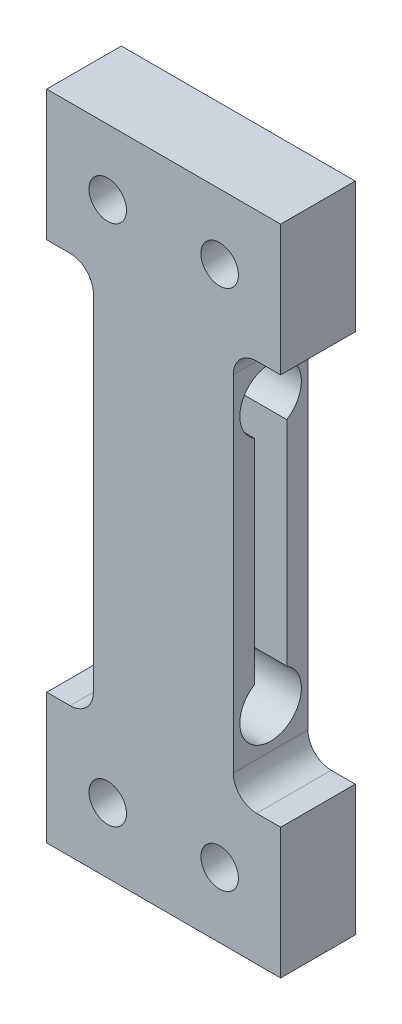
ISO-10303-21;
HEADER;
FILE_DESCRIPTION(('STEP AP214'),'2;1');
FILE_NAME('part.step','',(''),(''),'','','');
FILE_SCHEMA(('AUTOMOTIVE_DESIGN { 1 0 10303 214 1 1 1 1 }'));
ENDSEC;
DATA;
#1=APPLICATION_CONTEXT('core data for automotive mechanical design processes');
#2=APPLICATION_PROTOCOL_DEFINITION('international standard','automotive_design',2000,#1);
#3=PRODUCT_CONTEXT('',#1,'mechanical');
#4=PRODUCT('Part','Part','',(#3));
#5=PRODUCT_RELATED_PRODUCT_CATEGORY('part','',(#4));
#6=PRODUCT_DEFINITION_FORMATION('','',#4);
#7=PRODUCT_DEFINITION_CONTEXT('part definition',#1,'design');
#8=PRODUCT_DEFINITION('design','',#6,#7);
#9=PRODUCT_DEFINITION_SHAPE('','',#8);
#10=(LENGTH_UNIT() NAMED_UNIT(*) SI_UNIT(.MILLI.,.METRE.));
#11=(NAMED_UNIT(*) PLANE_ANGLE_UNIT() SI_UNIT($,.RADIAN.));
#12=(NAMED_UNIT(*) SI_UNIT($,.STERADIAN.) SOLID_ANGLE_UNIT());
#13=UNCERTAINTY_MEASURE_WITH_UNIT(LENGTH_MEASURE(1.E-05),#10,'distance_accuracy_value','');
#14=(GEOMETRIC_REPRESENTATION_CONTEXT(3) GLOBAL_UNCERTAINTY_ASSIGNED_CONTEXT((#13)) GLOBAL_UNIT_ASSIGNED_CONTEXT((#10,
#11,#12)) REPRESENTATION_CONTEXT('',''));
#15=CARTESIAN_POINT('',(0.,0.,0.));
#16=DIRECTION('',(0.,0.,1.));
#17=DIRECTION('',(1.,0.,0.));
#18=AXIS2_PLACEMENT_3D('',#15,#16,#17);
#19=CARTESIAN_POINT('',(-10.,0.,4.));
#20=DIRECTION('',(-1.,0.,0.));
#21=DIRECTION('',(0.,0.,1.));
#22=AXIS2_PLACEMENT_3D('',#19,#20,#21);
#23=PLANE('',#22);
#24=DIRECTION('',(0.,0.,1.));
#25=VECTOR('',#24,1.);
#26=CARTESIAN_POINT('',(-10.,28.,0.));
#27=LINE('',#26,#25);
#28=CARTESIAN_POINT('',(-10.,28.,0.));
#29=VERTEX_POINT('',#28);
#30=CARTESIAN_POINT('',(-10.,28.,4.));
#31=VERTEX_POINT('',#30);
#32=EDGE_CURVE('E222',#29,#31,#27,.T.);
#33=ORIENTED_EDGE('',*,*,#32,.T.);
#34=DIRECTION('',(0.,1.,0.));
#35=VECTOR('',#34,1.);
#36=CARTESIAN_POINT('',(-10.,0.,4.));
#37=LINE('',#36,#35);
#38=CARTESIAN_POINT('',(-10.,35.,4.));
#39=VERTEX_POINT('',#38);
#40=EDGE_CURVE('E259',#31,#39,#37,.T.);
#41=ORIENTED_EDGE('',*,*,#40,.T.);
#42=DIRECTION('',(0.,0.,-1.));
#43=VECTOR('',#42,1.);
#44=CARTESIAN_POINT('',(-10.,35.,4.));
#45=LINE('',#44,#43);
#46=CARTESIAN_POINT('',(-10.,35.,0.));
#47=VERTEX_POINT('',#46);
#48=EDGE_CURVE('E276',#39,#47,#45,.T.);
#49=ORIENTED_EDGE('',*,*,#48,.T.);
#50=DIRECTION('',(0.,1.,0.));
#51=VECTOR('',#50,1.);
#52=CARTESIAN_POINT('',(-10.,0.,0.));
#53=LINE('',#52,#51);
#54=EDGE_CURVE('E273',#29,#47,#53,.T.);
#55=ORIENTED_EDGE('',*,*,#54,.F.);
#56=EDGE_LOOP('',(#33,#41,#49,#55));
#57=FACE_BOUND('',#56,.T.);
#58=ADVANCED_FACE('F36',(#57),#23,.T.);
#59=CARTESIAN_POINT('',(2.53843426704407,35.,4.));
#60=DIRECTION('',(1.,0.,0.));
#61=DIRECTION('',(0.,0.,-1.));
#62=AXIS2_PLACEMENT_3D('',#59,#60,#61);
#63=PLANE('',#62);
#64=DIRECTION('',(0.,0.,1.));
#65=VECTOR('',#64,1.);
#66=CARTESIAN_POINT('',(2.53843426704407,7.,0.));
#67=LINE('',#66,#65);
#68=CARTESIAN_POINT('',(2.53843426704407,7.,0.));
#69=VERTEX_POINT('',#68);
#70=CARTESIAN_POINT('',(2.53843426704407,7.,4.));
#71=VERTEX_POINT('',#70);
#72=EDGE_CURVE('E243',#69,#71,#67,.T.);
#73=ORIENTED_EDGE('',*,*,#72,.T.);
#74=DIRECTION('',(0.,-1.,0.));
#75=VECTOR('',#74,1.);
#76=CARTESIAN_POINT('',(2.53843426704407,35.,4.));
#77=LINE('',#76,#75);
#78=CARTESIAN_POINT('',(2.53843426704407,0.,4.));
#79=VERTEX_POINT('',#78);
#80=EDGE_CURVE('E251',#71,#79,#77,.T.);
#81=ORIENTED_EDGE('',*,*,#80,.T.);
#82=DIRECTION('',(0.,0.,-1.));
#83=VECTOR('',#82,1.);
#84=CARTESIAN_POINT('',(2.53843426704407,0.,4.));
#85=LINE('',#84,#83);
#86=CARTESIAN_POINT('',(2.53843426704407,0.,0.));
#87=VERTEX_POINT('',#86);
#88=EDGE_CURVE('E282',#79,#87,#85,.T.);
#89=ORIENTED_EDGE('',*,*,#88,.T.);
#90=DIRECTION('',(0.,-1.,0.));
#91=VECTOR('',#90,1.);
#92=CARTESIAN_POINT('',(2.53843426704407,35.,0.));
#93=LINE('',#92,#91);
#94=EDGE_CURVE('E266',#69,#87,#93,.T.);
#95=ORIENTED_EDGE('',*,*,#94,.F.);
#96=EDGE_LOOP('',(#73,#81,#89,#95));
#97=FACE_BOUND('',#96,.T.);
#98=ADVANCED_FACE('F356',(#97),#63,.T.);
#99=CARTESIAN_POINT('',(-10.,35.,4.));
#100=DIRECTION('',(0.,1.,0.));
#101=DIRECTION('',(0.,0.,1.));
#102=AXIS2_PLACEMENT_3D('',#99,#100,#101);
#103=PLANE('',#102);
#104=DIRECTION('',(1.,0.,0.));
#105=VECTOR('',#104,1.);
#106=CARTESIAN_POINT('',(-10.,35.,0.));
#107=LINE('',#106,#105);
#108=CARTESIAN_POINT('',(2.53843426704407,35.,0.));
#109=VERTEX_POINT('',#108);
#110=EDGE_CURVE('E246',#47,#109,#107,.T.);
#111=ORIENTED_EDGE('',*,*,#110,.F.);
#112=ORIENTED_EDGE('',*,*,#48,.F.);
#113=DIRECTION('',(1.,0.,0.));
#114=VECTOR('',#113,1.);
#115=CARTESIAN_POINT('',(-10.,35.,4.));
#116=LINE('',#115,#114);
#117=CARTESIAN_POINT('',(2.53843426704407,35.,4.));
#118=VERTEX_POINT('',#117);
#119=EDGE_CURVE('E248',#39,#118,#116,.T.);
#120=ORIENTED_EDGE('',*,*,#119,.T.);
#121=DIRECTION('',(0.,0.,-1.));
#122=VECTOR('',#121,1.);
#123=CARTESIAN_POINT('',(2.53843426704407,35.,4.));
#124=LINE('',#123,#122);
#125=EDGE_CURVE('E263',#118,#109,#124,.T.);
#126=ORIENTED_EDGE('',*,*,#125,.T.);
#127=EDGE_LOOP('',(#111,#112,#120,#126));
#128=FACE_BOUND('',#127,.T.);
#129=ADVANCED_FACE('F384',(#128),#103,.T.);
#130=DIRECTION('',(0.,0.,1.));
#131=VECTOR('',#130,1.);
#132=CARTESIAN_POINT('',(-10.,7.,0.));
#133=LINE('',#132,#131);
#134=CARTESIAN_POINT('',(-10.,7.,0.));
#135=VERTEX_POINT('',#134);
#136=CARTESIAN_POINT('',(-10.,7.,4.));
#137=VERTEX_POINT('',#136);
#138=EDGE_CURVE('E216',#135,#137,#133,.T.);
#139=ORIENTED_EDGE('',*,*,#138,.F.);
#140=CARTESIAN_POINT('',(-10.,0.,0.));
#141=VERTEX_POINT('',#140);
#142=EDGE_CURVE('E252',#141,#135,#53,.T.);
#143=ORIENTED_EDGE('',*,*,#142,.F.);
#144=DIRECTION('',(0.,0.,-1.));
#145=VECTOR('',#144,1.);
#146=CARTESIAN_POINT('',(-10.,0.,4.));
#147=LINE('',#146,#145);
#148=CARTESIAN_POINT('',(-10.,0.,4.));
#149=VERTEX_POINT('',#148);
#150=EDGE_CURVE('E280',#149,#141,#147,.T.);
#151=ORIENTED_EDGE('',*,*,#150,.F.);
#152=EDGE_CURVE('E260',#149,#137,#37,.T.);
#153=ORIENTED_EDGE('',*,*,#152,.T.);
#154=EDGE_LOOP('',(#139,#143,#151,#153));
#155=FACE_BOUND('',#154,.T.);
#156=ADVANCED_FACE('F345',(#155),#23,.T.);
#157=CARTESIAN_POINT('',(2.53843426704407,0.,4.));
#158=DIRECTION('',(0.,-1.,0.));
#159=DIRECTION('',(1.,0.,0.));
#160=AXIS2_PLACEMENT_3D('',#157,#158,#159);
#161=PLANE('',#160);
#162=DIRECTION('',(-1.,0.,0.));
#163=VECTOR('',#162,1.);
#164=CARTESIAN_POINT('',(2.53843426704407,0.,0.));
#165=LINE('',#164,#163);
#166=EDGE_CURVE('E270',#87,#141,#165,.T.);
#167=ORIENTED_EDGE('',*,*,#166,.F.);
#168=ORIENTED_EDGE('',*,*,#88,.F.);
#169=DIRECTION('',(-1.,0.,0.));
#170=VECTOR('',#169,1.);
#171=CARTESIAN_POINT('',(2.53843426704407,0.,4.));
#172=LINE('',#171,#170);
#173=EDGE_CURVE('E256',#79,#149,#172,.T.);
#174=ORIENTED_EDGE('',*,*,#173,.T.);
#175=ORIENTED_EDGE('',*,*,#150,.T.);
#176=EDGE_LOOP('',(#167,#168,#174,#175));
#177=FACE_BOUND('',#176,.T.);
#178=ADVANCED_FACE('F353',(#177),#161,.T.);
#179=DIRECTION('',(0.,0.,1.));
#180=VECTOR('',#179,1.);
#181=CARTESIAN_POINT('',(2.53843426704407,28.,0.));
#182=LINE('',#181,#180);
#183=CARTESIAN_POINT('',(2.53843426704407,28.,0.));
#184=VERTEX_POINT('',#183);
#185=CARTESIAN_POINT('',(2.53843426704407,28.,4.));
#186=VERTEX_POINT('',#185);
#187=EDGE_CURVE('E236',#184,#186,#182,.T.);
#188=ORIENTED_EDGE('',*,*,#187,.F.);
#189=EDGE_CURVE('E267',#109,#184,#93,.T.);
#190=ORIENTED_EDGE('',*,*,#189,.F.);
#191=ORIENTED_EDGE('',*,*,#125,.F.);
#192=EDGE_CURVE('E253',#118,#186,#77,.T.);
#193=ORIENTED_EDGE('',*,*,#192,.T.);
#194=EDGE_LOOP('',(#188,#190,#191,#193));
#195=FACE_BOUND('',#194,.T.);
#196=ADVANCED_FACE('F380',(#195),#63,.T.);
#197=CARTESIAN_POINT('',(0.,0.,4.));
#198=DIRECTION('',(0.,0.,-1.));
#199=DIRECTION('',(-1.,0.,0.));
#200=AXIS2_PLACEMENT_3D('',#197,#198,#199);
#201=PLANE('',#200);
#202=CARTESIAN_POINT('',(-0.730782866478019,3.49999999999998,4.));
#203=DIRECTION('',(0.,0.,-1.));
#204=DIRECTION('',(-1.,0.,0.));
#205=AXIS2_PLACEMENT_3D('',#202,#203,#204);
#206=CIRCLE('',#205,1.00650000000001);
#207=CARTESIAN_POINT('',(-1.73728286647803,3.49999999999998,4.));
#208=VERTEX_POINT('',#207);
#209=EDGE_CURVE('E630',#208,#208,#206,.T.);
#210=ORIENTED_EDGE('',*,*,#209,.T.);
#211=EDGE_LOOP('',(#210));
#212=FACE_BOUND('',#211,.T.);
#213=CARTESIAN_POINT('',(-6.73078286647802,3.5,4.));
#214=DIRECTION('',(0.,0.,-1.));
#215=DIRECTION('',(-1.,0.,0.));
#216=AXIS2_PLACEMENT_3D('',#213,#214,#215);
#217=CIRCLE('',#216,1.00650000000001);
#218=CARTESIAN_POINT('',(-7.73728286647803,3.5,4.));
#219=VERTEX_POINT('',#218);
#220=EDGE_CURVE('E624',#219,#219,#217,.T.);
#221=ORIENTED_EDGE('',*,*,#220,.T.);
#222=EDGE_LOOP('',(#221));
#223=FACE_BOUND('',#222,.T.);
#224=CARTESIAN_POINT('',(-0.730782866478016,31.5,4.));
#225=DIRECTION('',(0.,0.,-1.));
#226=DIRECTION('',(-1.,0.,0.));
#227=AXIS2_PLACEMENT_3D('',#224,#225,#226);
#228=CIRCLE('',#227,1.00650000000001);
#229=CARTESIAN_POINT('',(-1.73728286647803,31.5,4.));
#230=VERTEX_POINT('',#229);
#231=EDGE_CURVE('E618',#230,#230,#228,.T.);
#232=ORIENTED_EDGE('',*,*,#231,.T.);
#233=EDGE_LOOP('',(#232));
#234=FACE_BOUND('',#233,.T.);
#235=CARTESIAN_POINT('',(-6.73078286647802,31.5,4.));
#236=DIRECTION('',(0.,0.,-1.));
#237=DIRECTION('',(-1.,0.,0.));
#238=AXIS2_PLACEMENT_3D('',#235,#236,#237);
#239=CIRCLE('',#238,1.00650000000001);
#240=CARTESIAN_POINT('',(-7.73728286647803,31.5,4.));
#241=VERTEX_POINT('',#240);
#242=EDGE_CURVE('E194',#241,#241,#239,.T.);
#243=ORIENTED_EDGE('',*,*,#242,.T.);
#244=EDGE_LOOP('',(#243));
#245=FACE_BOUND('',#244,.T.);
#246=ORIENTED_EDGE('',*,*,#40,.F.);
#247=DIRECTION('',(-1.,0.,0.));
#248=VECTOR('',#247,1.);
#249=CARTESIAN_POINT('',(-7.5,28.,4.));
#250=LINE('',#249,#248);
#251=CARTESIAN_POINT('',(-8.74999999999999,28.,4.));
#252=VERTEX_POINT('',#251);
#253=EDGE_CURVE('E211',#252,#31,#250,.T.);
#254=ORIENTED_EDGE('',*,*,#253,.F.);
#255=CARTESIAN_POINT('',(-8.75,26.75,4.));
#256=DIRECTION('',(0.,0.,-1.));
#257=DIRECTION('',(-1.,0.,0.));
#258=AXIS2_PLACEMENT_3D('',#255,#256,#257);
#259=CIRCLE('',#258,1.25);
#260=CARTESIAN_POINT('',(-7.5,26.75,4.));
#261=VERTEX_POINT('',#260);
#262=EDGE_CURVE('E317',#252,#261,#259,.T.);
#263=ORIENTED_EDGE('',*,*,#262,.T.);
#264=DIRECTION('',(0.,1.,0.));
#265=VECTOR('',#264,1.);
#266=CARTESIAN_POINT('',(-7.5,6.99999999999999,4.));
#267=LINE('',#266,#265);
#268=CARTESIAN_POINT('',(-7.5,8.24999999999999,4.));
#269=VERTEX_POINT('',#268);
#270=EDGE_CURVE('E218',#269,#261,#267,.T.);
#271=ORIENTED_EDGE('',*,*,#270,.F.);
#272=CARTESIAN_POINT('',(-8.75,8.24999999999999,4.));
#273=DIRECTION('',(0.,0.,-1.));
#274=DIRECTION('',(-1.,0.,0.));
#275=AXIS2_PLACEMENT_3D('',#272,#273,#274);
#276=CIRCLE('',#275,1.25);
#277=CARTESIAN_POINT('',(-8.75000000000001,6.99999999999999,4.));
#278=VERTEX_POINT('',#277);
#279=EDGE_CURVE('E44',#269,#278,#276,.T.);
#280=ORIENTED_EDGE('',*,*,#279,.T.);
#281=DIRECTION('',(1.,0.,0.));
#282=VECTOR('',#281,1.);
#283=CARTESIAN_POINT('',(-10.,7.,4.));
#284=LINE('',#283,#282);
#285=EDGE_CURVE('E182',#137,#278,#284,.T.);
#286=ORIENTED_EDGE('',*,*,#285,.F.);
#287=ORIENTED_EDGE('',*,*,#152,.F.);
#288=ORIENTED_EDGE('',*,*,#173,.F.);
#289=ORIENTED_EDGE('',*,*,#80,.F.);
#290=DIRECTION('',(1.,0.,0.));
#291=VECTOR('',#290,1.);
#292=CARTESIAN_POINT('',(0.,6.99999999999999,4.));
#293=LINE('',#292,#291);
#294=CARTESIAN_POINT('',(1.25,7.,4.));
#295=VERTEX_POINT('',#294);
#296=EDGE_CURVE('E231',#295,#71,#293,.T.);
#297=ORIENTED_EDGE('',*,*,#296,.F.);
#298=CARTESIAN_POINT('',(1.25,8.25,4.));
#299=DIRECTION('',(0.,0.,-1.));
#300=DIRECTION('',(-1.,0.,0.));
#301=AXIS2_PLACEMENT_3D('',#298,#299,#300);
#302=CIRCLE('',#301,1.25);
#303=CARTESIAN_POINT('',(0.,8.25,4.));
#304=VERTEX_POINT('',#303);
#305=EDGE_CURVE('E313',#295,#304,#302,.T.);
#306=ORIENTED_EDGE('',*,*,#305,.T.);
#307=DIRECTION('',(0.,-1.,0.));
#308=VECTOR('',#307,1.);
#309=CARTESIAN_POINT('',(0.,28.,4.));
#310=LINE('',#309,#308);
#311=CARTESIAN_POINT('',(0.,26.75,4.));
#312=VERTEX_POINT('',#311);
#313=EDGE_CURVE('E239',#312,#304,#310,.T.);
#314=ORIENTED_EDGE('',*,*,#313,.F.);
#315=CARTESIAN_POINT('',(1.25,26.75,4.));
#316=DIRECTION('',(0.,0.,-1.));
#317=DIRECTION('',(-1.,0.,0.));
#318=AXIS2_PLACEMENT_3D('',#315,#316,#317);
#319=CIRCLE('',#318,1.25);
#320=CARTESIAN_POINT('',(1.25,28.,4.));
#321=VERTEX_POINT('',#320);
#322=EDGE_CURVE('E309',#312,#321,#319,.T.);
#323=ORIENTED_EDGE('',*,*,#322,.T.);
#324=DIRECTION('',(-1.,0.,0.));
#325=VECTOR('',#324,1.);
#326=CARTESIAN_POINT('',(2.53843426704407,28.,4.));
#327=LINE('',#326,#325);
#328=EDGE_CURVE('E225',#186,#321,#327,.T.);
#329=ORIENTED_EDGE('',*,*,#328,.F.);
#330=ORIENTED_EDGE('',*,*,#192,.F.);
#331=ORIENTED_EDGE('',*,*,#119,.F.);
#332=EDGE_LOOP('',(#246,#254,#263,#271,#280,#286,#287,#288,#289,#297,#306,#314,#323,#329,#330,#331));
#333=FACE_BOUND('',#332,.T.);
#334=ADVANCED_FACE('F335',(#212,#223,#234,#245,#333),#201,.F.);
#335=CARTESIAN_POINT('',(0.,0.,0.));
#336=DIRECTION('',(0.,0.,-1.));
#337=DIRECTION('',(-1.,0.,0.));
#338=AXIS2_PLACEMENT_3D('',#335,#336,#337);
#339=PLANE('',#338);
#340=CARTESIAN_POINT('',(-0.730782866478019,3.49999999999998,0.));
#341=DIRECTION('',(0.,0.,-1.));
#342=DIRECTION('',(-1.,0.,0.));
#343=AXIS2_PLACEMENT_3D('',#340,#341,#342);
#344=CIRCLE('',#343,1.00650000000001);
#345=CARTESIAN_POINT('',(-1.73728286647803,3.49999999999998,0.));
#346=VERTEX_POINT('',#345);
#347=EDGE_CURVE('E633',#346,#346,#344,.T.);
#348=ORIENTED_EDGE('',*,*,#347,.F.);
#349=EDGE_LOOP('',(#348));
#350=FACE_BOUND('',#349,.T.);
#351=CARTESIAN_POINT('',(-6.73078286647802,3.5,0.));
#352=DIRECTION('',(0.,0.,-1.));
#353=DIRECTION('',(-1.,0.,0.));
#354=AXIS2_PLACEMENT_3D('',#351,#352,#353);
#355=CIRCLE('',#354,1.00650000000001);
#356=CARTESIAN_POINT('',(-7.73728286647803,3.5,0.));
#357=VERTEX_POINT('',#356);
#358=EDGE_CURVE('E627',#357,#357,#355,.T.);
#359=ORIENTED_EDGE('',*,*,#358,.F.);
#360=EDGE_LOOP('',(#359));
#361=FACE_BOUND('',#360,.T.);
#362=CARTESIAN_POINT('',(-0.730782866478016,31.5,0.));
#363=DIRECTION('',(0.,0.,-1.));
#364=DIRECTION('',(-1.,0.,0.));
#365=AXIS2_PLACEMENT_3D('',#362,#363,#364);
#366=CIRCLE('',#365,1.00650000000001);
#367=CARTESIAN_POINT('',(-1.73728286647803,31.5,0.));
#368=VERTEX_POINT('',#367);
#369=EDGE_CURVE('E621',#368,#368,#366,.T.);
#370=ORIENTED_EDGE('',*,*,#369,.F.);
#371=EDGE_LOOP('',(#370));
#372=FACE_BOUND('',#371,.T.);
#373=CARTESIAN_POINT('',(-6.73078286647802,31.5,0.));
#374=DIRECTION('',(0.,0.,-1.));
#375=DIRECTION('',(-1.,0.,0.));
#376=AXIS2_PLACEMENT_3D('',#373,#374,#375);
#377=CIRCLE('',#376,1.00650000000001);
#378=CARTESIAN_POINT('',(-7.73728286647803,31.5,0.));
#379=VERTEX_POINT('',#378);
#380=EDGE_CURVE('E615',#379,#379,#377,.T.);
#381=ORIENTED_EDGE('',*,*,#380,.F.);
#382=EDGE_LOOP('',(#381));
#383=FACE_BOUND('',#382,.T.);
#384=DIRECTION('',(0.,1.,0.));
#385=VECTOR('',#384,1.);
#386=CARTESIAN_POINT('',(-7.5,6.99999999999999,0.));
#387=LINE('',#386,#385);
#388=CARTESIAN_POINT('',(-7.5,8.24999999999999,0.));
#389=VERTEX_POINT('',#388);
#390=CARTESIAN_POINT('',(-7.5,26.75,0.));
#391=VERTEX_POINT('',#390);
#392=EDGE_CURVE('E210',#389,#391,#387,.T.);
#393=ORIENTED_EDGE('',*,*,#392,.T.);
#394=CARTESIAN_POINT('',(-8.75,26.75,0.));
#395=DIRECTION('',(0.,0.,-1.));
#396=DIRECTION('',(-1.,0.,0.));
#397=AXIS2_PLACEMENT_3D('',#394,#395,#396);
#398=CIRCLE('',#397,1.25);
#399=CARTESIAN_POINT('',(-8.74999999999999,28.,0.));
#400=VERTEX_POINT('',#399);
#401=EDGE_CURVE('E319',#391,#400,#398,.F.);
#402=ORIENTED_EDGE('',*,*,#401,.T.);
#403=DIRECTION('',(-1.,0.,0.));
#404=VECTOR('',#403,1.);
#405=CARTESIAN_POINT('',(-7.5,28.,0.));
#406=LINE('',#405,#404);
#407=EDGE_CURVE('E214',#400,#29,#406,.T.);
#408=ORIENTED_EDGE('',*,*,#407,.T.);
#409=ORIENTED_EDGE('',*,*,#54,.T.);
#410=ORIENTED_EDGE('',*,*,#110,.T.);
#411=ORIENTED_EDGE('',*,*,#189,.T.);
#412=DIRECTION('',(-1.,0.,0.));
#413=VECTOR('',#412,1.);
#414=CARTESIAN_POINT('',(2.53843426704407,28.,0.));
#415=LINE('',#414,#413);
#416=CARTESIAN_POINT('',(1.25,28.,0.));
#417=VERTEX_POINT('',#416);
#418=EDGE_CURVE('E227',#184,#417,#415,.T.);
#419=ORIENTED_EDGE('',*,*,#418,.T.);
#420=CARTESIAN_POINT('',(1.25,26.75,0.));
#421=DIRECTION('',(0.,0.,-1.));
#422=DIRECTION('',(-1.,0.,0.));
#423=AXIS2_PLACEMENT_3D('',#420,#421,#422);
#424=CIRCLE('',#423,1.25);
#425=CARTESIAN_POINT('',(0.,26.75,0.));
#426=VERTEX_POINT('',#425);
#427=EDGE_CURVE('E311',#417,#426,#424,.F.);
#428=ORIENTED_EDGE('',*,*,#427,.T.);
#429=DIRECTION('',(0.,-1.,0.));
#430=VECTOR('',#429,1.);
#431=CARTESIAN_POINT('',(0.,28.,0.));
#432=LINE('',#431,#430);
#433=CARTESIAN_POINT('',(0.,8.25,0.));
#434=VERTEX_POINT('',#433);
#435=EDGE_CURVE('E230',#426,#434,#432,.T.);
#436=ORIENTED_EDGE('',*,*,#435,.T.);
#437=CARTESIAN_POINT('',(1.25,8.25,0.));
#438=DIRECTION('',(0.,0.,-1.));
#439=DIRECTION('',(-1.,0.,0.));
#440=AXIS2_PLACEMENT_3D('',#437,#438,#439);
#441=CIRCLE('',#440,1.25);
#442=CARTESIAN_POINT('',(1.25,7.,0.));
#443=VERTEX_POINT('',#442);
#444=EDGE_CURVE('E315',#434,#443,#441,.F.);
#445=ORIENTED_EDGE('',*,*,#444,.T.);
#446=DIRECTION('',(1.,0.,0.));
#447=VECTOR('',#446,1.);
#448=CARTESIAN_POINT('',(0.,6.99999999999999,0.));
#449=LINE('',#448,#447);
#450=EDGE_CURVE('E234',#443,#69,#449,.T.);
#451=ORIENTED_EDGE('',*,*,#450,.T.);
#452=ORIENTED_EDGE('',*,*,#94,.T.);
#453=ORIENTED_EDGE('',*,*,#166,.T.);
#454=ORIENTED_EDGE('',*,*,#142,.T.);
#455=DIRECTION('',(1.,0.,0.));
#456=VECTOR('',#455,1.);
#457=CARTESIAN_POINT('',(-10.,7.,0.));
#458=LINE('',#457,#456);
#459=CARTESIAN_POINT('',(-8.75000000000001,6.99999999999999,0.));
#460=VERTEX_POINT('',#459);
#461=EDGE_CURVE('E208',#135,#460,#458,.T.);
#462=ORIENTED_EDGE('',*,*,#461,.T.);
#463=CARTESIAN_POINT('',(-8.75,8.24999999999999,0.));
#464=DIRECTION('',(0.,0.,-1.));
#465=DIRECTION('',(-1.,0.,0.));
#466=AXIS2_PLACEMENT_3D('',#463,#464,#465);
#467=CIRCLE('',#466,1.25);
#468=EDGE_CURVE('E11',#460,#389,#467,.F.);
#469=ORIENTED_EDGE('',*,*,#468,.T.);
#470=EDGE_LOOP('',(#393,#402,#408,#409,#410,#411,#419,#428,#436,#445,#451,#452,#453,#454,#462,#469));
#471=FACE_BOUND('',#470,.T.);
#472=ADVANCED_FACE('F323',(#350,#361,#372,#383,#471),#339,.T.);
#473=CARTESIAN_POINT('',(0.,6.99999999999999,0.));
#474=DIRECTION('',(0.,-1.,0.));
#475=DIRECTION('',(1.,0.,0.));
#476=AXIS2_PLACEMENT_3D('',#473,#474,#475);
#477=PLANE('',#476);
#478=ORIENTED_EDGE('',*,*,#450,.F.);
#479=DIRECTION('',(0.,0.,1.));
#480=VECTOR('',#479,1.);
#481=CARTESIAN_POINT('',(1.25,7.,4.));
#482=LINE('',#481,#480);
#483=EDGE_CURVE('E297',#443,#295,#482,.T.);
#484=ORIENTED_EDGE('',*,*,#483,.T.);
#485=ORIENTED_EDGE('',*,*,#296,.T.);
#486=ORIENTED_EDGE('',*,*,#72,.F.);
#487=EDGE_LOOP('',(#478,#484,#485,#486));
#488=FACE_BOUND('',#487,.T.);
#489=ADVANCED_FACE('F360',(#488),#477,.F.);
#490=CARTESIAN_POINT('',(0.,28.,0.));
#491=DIRECTION('',(-1.,0.,0.));
#492=DIRECTION('',(0.,-1.,0.));
#493=AXIS2_PLACEMENT_3D('',#490,#491,#492);
#494=PLANE('',#493);
#495=DIRECTION('',(0.,-1.,0.));
#496=VECTOR('',#495,1.);
#497=CARTESIAN_POINT('',(0.,23.2143698595176,2.85593376306962));
#498=LINE('',#497,#496);
#499=CARTESIAN_POINT('',(0.,23.2143698595176,2.85593376306962));
#500=VERTEX_POINT('',#499);
#501=CARTESIAN_POINT('',(0.,11.7856301404824,2.85593376306961));
#502=VERTEX_POINT('',#501);
#503=EDGE_CURVE('E193',#500,#502,#498,.T.);
#504=ORIENTED_EDGE('',*,*,#503,.F.);
#505=CARTESIAN_POINT('',(0.,24.625,2.));
#506=DIRECTION('',(1.,0.,0.));
#507=DIRECTION('',(0.,0.,-1.));
#508=AXIS2_PLACEMENT_3D('',#505,#506,#507);
#509=CIRCLE('',#508,1.65);
#510=CARTESIAN_POINT('',(0.,23.2218673192958,1.13183026985506));
#511=VERTEX_POINT('',#510);
#512=EDGE_CURVE('E174',#511,#500,#509,.T.);
#513=ORIENTED_EDGE('',*,*,#512,.F.);
#514=DIRECTION('',(0.,1.,0.));
#515=VECTOR('',#514,1.);
#516=CARTESIAN_POINT('',(0.,11.7781326807042,1.13183026985508));
#517=LINE('',#516,#515);
#518=CARTESIAN_POINT('',(0.,11.7781326807042,1.13183026985507));
#519=VERTEX_POINT('',#518);
#520=EDGE_CURVE('E191',#519,#511,#517,.T.);
#521=ORIENTED_EDGE('',*,*,#520,.F.);
#522=CARTESIAN_POINT('',(0.,10.375,2.));
#523=DIRECTION('',(1.,0.,0.));
#524=DIRECTION('',(0.,1.,0.));
#525=AXIS2_PLACEMENT_3D('',#522,#523,#524);
#526=CIRCLE('',#525,1.64999999999998);
#527=EDGE_CURVE('E608',#502,#519,#526,.T.);
#528=ORIENTED_EDGE('',*,*,#527,.F.);
#529=EDGE_LOOP('',(#504,#513,#521,#528));
#530=FACE_BOUND('',#529,.T.);
#531=ORIENTED_EDGE('',*,*,#435,.F.);
#532=DIRECTION('',(0.,0.,1.));
#533=VECTOR('',#532,1.);
#534=CARTESIAN_POINT('',(0.,26.75,4.));
#535=LINE('',#534,#533);
#536=EDGE_CURVE('E292',#426,#312,#535,.T.);
#537=ORIENTED_EDGE('',*,*,#536,.T.);
#538=ORIENTED_EDGE('',*,*,#313,.T.);
#539=DIRECTION('',(0.,0.,1.));
#540=VECTOR('',#539,1.);
#541=CARTESIAN_POINT('',(0.,8.25,0.));
#542=LINE('',#541,#540);
#543=EDGE_CURVE('E290',#304,#434,#542,.F.);
#544=ORIENTED_EDGE('',*,*,#543,.T.);
#545=EDGE_LOOP('',(#531,#537,#538,#544));
#546=FACE_BOUND('',#545,.T.);
#547=ADVANCED_FACE('F188',(#530,#546),#494,.F.);
#548=CARTESIAN_POINT('',(2.53843426704407,28.,0.));
#549=DIRECTION('',(0.,1.,0.));
#550=DIRECTION('',(-1.,0.,0.));
#551=AXIS2_PLACEMENT_3D('',#548,#549,#550);
#552=PLANE('',#551);
#553=ORIENTED_EDGE('',*,*,#328,.T.);
#554=DIRECTION('',(0.,0.,1.));
#555=VECTOR('',#554,1.);
#556=CARTESIAN_POINT('',(1.24999999999999,28.,0.));
#557=LINE('',#556,#555);
#558=EDGE_CURVE('E295',#321,#417,#557,.F.);
#559=ORIENTED_EDGE('',*,*,#558,.T.);
#560=ORIENTED_EDGE('',*,*,#418,.F.);
#561=ORIENTED_EDGE('',*,*,#187,.T.);
#562=EDGE_LOOP('',(#553,#559,#560,#561));
#563=FACE_BOUND('',#562,.T.);
#564=ADVANCED_FACE('F376',(#563),#552,.F.);
#565=CARTESIAN_POINT('',(-7.5,28.,0.));
#566=DIRECTION('',(0.,1.,0.));
#567=DIRECTION('',(-1.,0.,0.));
#568=AXIS2_PLACEMENT_3D('',#565,#566,#567);
#569=PLANE('',#568);
#570=ORIENTED_EDGE('',*,*,#407,.F.);
#571=DIRECTION('',(0.,0.,1.));
#572=VECTOR('',#571,1.);
#573=CARTESIAN_POINT('',(-8.74999999999999,28.,4.));
#574=LINE('',#573,#572);
#575=EDGE_CURVE('E300',#400,#252,#574,.T.);
#576=ORIENTED_EDGE('',*,*,#575,.T.);
#577=ORIENTED_EDGE('',*,*,#253,.T.);
#578=ORIENTED_EDGE('',*,*,#32,.F.);
#579=EDGE_LOOP('',(#570,#576,#577,#578));
#580=FACE_BOUND('',#579,.T.);
#581=ADVANCED_FACE('F330',(#580),#569,.F.);
#582=CARTESIAN_POINT('',(-7.5,6.99999999999999,0.));
#583=DIRECTION('',(1.,0.,0.));
#584=DIRECTION('',(0.,1.,0.));
#585=AXIS2_PLACEMENT_3D('',#582,#583,#584);
#586=PLANE('',#585);
#587=DIRECTION('',(0.,1.,0.));
#588=VECTOR('',#587,1.);
#589=CARTESIAN_POINT('',(-7.5,6.99999999999999,1.13183026985508));
#590=LINE('',#589,#588);
#591=CARTESIAN_POINT('',(-7.5,11.7781326807042,1.13183026985507));
#592=VERTEX_POINT('',#591);
#593=CARTESIAN_POINT('',(-7.5,23.2218673192959,1.13183026985506));
#594=VERTEX_POINT('',#593);
#595=EDGE_CURVE('E288',#592,#594,#590,.T.);
#596=ORIENTED_EDGE('',*,*,#595,.T.);
#597=CARTESIAN_POINT('',(-7.5,24.625,2.));
#598=DIRECTION('',(1.,0.,0.));
#599=DIRECTION('',(0.,0.,-1.));
#600=AXIS2_PLACEMENT_3D('',#597,#598,#599);
#601=CIRCLE('',#600,1.64999999999999);
#602=CARTESIAN_POINT('',(-7.5,23.2143698595176,2.85593376306962));
#603=VERTEX_POINT('',#602);
#604=EDGE_CURVE('E177',#594,#603,#601,.T.);
#605=ORIENTED_EDGE('',*,*,#604,.T.);
#606=DIRECTION('',(0.,-1.,0.));
#607=VECTOR('',#606,1.);
#608=CARTESIAN_POINT('',(-7.5,6.99999999999998,2.85593376306961));
#609=LINE('',#608,#607);
#610=CARTESIAN_POINT('',(-7.5,11.7856301404824,2.85593376306961));
#611=VERTEX_POINT('',#610);
#612=EDGE_CURVE('E279',#603,#611,#609,.T.);
#613=ORIENTED_EDGE('',*,*,#612,.T.);
#614=CARTESIAN_POINT('',(-7.5,10.375,2.));
#615=DIRECTION('',(1.,0.,0.));
#616=DIRECTION('',(0.,1.,0.));
#617=AXIS2_PLACEMENT_3D('',#614,#615,#616);
#618=CIRCLE('',#617,1.64999999999999);
#619=EDGE_CURVE('E202',#611,#592,#618,.T.);
#620=ORIENTED_EDGE('',*,*,#619,.T.);
#621=EDGE_LOOP('',(#596,#605,#613,#620));
#622=FACE_BOUND('',#621,.T.);
#623=ORIENTED_EDGE('',*,*,#270,.T.);
#624=DIRECTION('',(0.,0.,1.));
#625=VECTOR('',#624,1.);
#626=CARTESIAN_POINT('',(-7.5,26.75,0.));
#627=LINE('',#626,#625);
#628=EDGE_CURVE('E306',#261,#391,#627,.F.);
#629=ORIENTED_EDGE('',*,*,#628,.T.);
#630=ORIENTED_EDGE('',*,*,#392,.F.);
#631=DIRECTION('',(0.,0.,1.));
#632=VECTOR('',#631,1.);
#633=CARTESIAN_POINT('',(-7.5,8.24999999999999,4.));
#634=LINE('',#633,#632);
#635=EDGE_CURVE('E303',#389,#269,#634,.T.);
#636=ORIENTED_EDGE('',*,*,#635,.T.);
#637=EDGE_LOOP('',(#623,#629,#630,#636));
#638=FACE_BOUND('',#637,.T.);
#639=ADVANCED_FACE('F337',(#622,#638),#586,.F.);
#640=CARTESIAN_POINT('',(-10.,7.,0.));
#641=DIRECTION('',(0.,-1.,0.));
#642=DIRECTION('',(1.,0.,0.));
#643=AXIS2_PLACEMENT_3D('',#640,#641,#642);
#644=PLANE('',#643);
#645=ORIENTED_EDGE('',*,*,#285,.T.);
#646=DIRECTION('',(0.,0.,1.));
#647=VECTOR('',#646,1.);
#648=CARTESIAN_POINT('',(-8.75000000000001,6.99999999999999,0.));
#649=LINE('',#648,#647);
#650=EDGE_CURVE('E51',#278,#460,#649,.F.);
#651=ORIENTED_EDGE('',*,*,#650,.T.);
#652=ORIENTED_EDGE('',*,*,#461,.F.);
#653=ORIENTED_EDGE('',*,*,#138,.T.);
#654=EDGE_LOOP('',(#645,#651,#652,#653));
#655=FACE_BOUND('',#654,.T.);
#656=ADVANCED_FACE('F343',(#655),#644,.F.);
#657=CARTESIAN_POINT('',(-10.,11.7781326807042,1.13183026985508));
#658=DIRECTION('',(0.,0.,-1.));
#659=DIRECTION('',(0.,1.,0.));
#660=AXIS2_PLACEMENT_3D('',#657,#658,#659);
#661=PLANE('',#660);
#662=DIRECTION('',(1.,0.,0.));
#663=VECTOR('',#662,1.);
#664=CARTESIAN_POINT('',(-10.,11.7781326807042,1.13183026985508));
#665=LINE('',#664,#663);
#666=EDGE_CURVE('E183',#592,#519,#665,.T.);
#667=ORIENTED_EDGE('',*,*,#666,.T.);
#668=ORIENTED_EDGE('',*,*,#520,.T.);
#669=DIRECTION('',(1.,0.,0.));
#670=VECTOR('',#669,1.);
#671=CARTESIAN_POINT('',(-10.,23.2218673192958,1.13183026985506));
#672=LINE('',#671,#670);
#673=EDGE_CURVE('E171',#594,#511,#672,.T.);
#674=ORIENTED_EDGE('',*,*,#673,.F.);
#675=ORIENTED_EDGE('',*,*,#595,.F.);
#676=EDGE_LOOP('',(#667,#668,#674,#675));
#677=FACE_BOUND('',#676,.T.);
#678=ADVANCED_FACE('F197',(#677),#661,.F.);
#679=CARTESIAN_POINT('',(-10.,23.2143698595176,2.85593376306962));
#680=DIRECTION('',(0.,0.,1.));
#681=DIRECTION('',(0.,-1.,0.));
#682=AXIS2_PLACEMENT_3D('',#679,#680,#681);
#683=PLANE('',#682);
#684=DIRECTION('',(1.,0.,0.));
#685=VECTOR('',#684,1.);
#686=CARTESIAN_POINT('',(-10.,23.2143698595176,2.85593376306962));
#687=LINE('',#686,#685);
#688=EDGE_CURVE('E198',#603,#500,#687,.T.);
#689=ORIENTED_EDGE('',*,*,#688,.T.);
#690=ORIENTED_EDGE('',*,*,#503,.T.);
#691=DIRECTION('',(1.,0.,0.));
#692=VECTOR('',#691,1.);
#693=CARTESIAN_POINT('',(-10.,11.7856301404824,2.85593376306961));
#694=LINE('',#693,#692);
#695=EDGE_CURVE('E200',#611,#502,#694,.T.);
#696=ORIENTED_EDGE('',*,*,#695,.F.);
#697=ORIENTED_EDGE('',*,*,#612,.F.);
#698=EDGE_LOOP('',(#689,#690,#696,#697));
#699=FACE_BOUND('',#698,.T.);
#700=ADVANCED_FACE('F557',(#699),#683,.F.);
#701=CARTESIAN_POINT('',(-7.5,10.375,2.));
#702=DIRECTION('',(1.,0.,0.));
#703=DIRECTION('',(0.,1.,0.));
#704=AXIS2_PLACEMENT_3D('',#701,#702,#703);
#705=CYLINDRICAL_SURFACE('',#704,1.64999999999999);
#706=ORIENTED_EDGE('',*,*,#619,.F.);
#707=ORIENTED_EDGE('',*,*,#695,.T.);
#708=ORIENTED_EDGE('',*,*,#527,.T.);
#709=ORIENTED_EDGE('',*,*,#666,.F.);
#710=EDGE_LOOP('',(#706,#707,#708,#709));
#711=FACE_BOUND('',#710,.T.);
#712=ADVANCED_FACE('F550',(#711),#705,.F.);
#713=CARTESIAN_POINT('',(-7.5,24.625,2.));
#714=DIRECTION('',(1.,0.,0.));
#715=DIRECTION('',(0.,0.,-1.));
#716=AXIS2_PLACEMENT_3D('',#713,#714,#715);
#717=CYLINDRICAL_SURFACE('',#716,1.65);
#718=ORIENTED_EDGE('',*,*,#512,.T.);
#719=ORIENTED_EDGE('',*,*,#688,.F.);
#720=ORIENTED_EDGE('',*,*,#604,.F.);
#721=ORIENTED_EDGE('',*,*,#673,.T.);
#722=EDGE_LOOP('',(#718,#719,#720,#721));
#723=FACE_BOUND('',#722,.T.);
#724=ADVANCED_FACE('F173',(#723),#717,.F.);
#725=CARTESIAN_POINT('',(-6.73078286647802,31.5,0.));
#726=DIRECTION('',(0.,0.,-1.));
#727=DIRECTION('',(-1.,0.,0.));
#728=AXIS2_PLACEMENT_3D('',#725,#726,#727);
#729=CYLINDRICAL_SURFACE('',#728,1.00650000000001);
#730=ORIENTED_EDGE('',*,*,#242,.F.);
#731=EDGE_LOOP('',(#730));
#732=FACE_BOUND('',#731,.T.);
#733=ORIENTED_EDGE('',*,*,#380,.T.);
#734=EDGE_LOOP('',(#733));
#735=FACE_BOUND('',#734,.T.);
#736=ADVANCED_FACE('F531',(#732,#735),#729,.F.);
#737=CARTESIAN_POINT('',(-0.730782866478016,31.5,0.));
#738=DIRECTION('',(0.,0.,-1.));
#739=DIRECTION('',(-1.,0.,0.));
#740=AXIS2_PLACEMENT_3D('',#737,#738,#739);
#741=CYLINDRICAL_SURFACE('',#740,1.00650000000001);
#742=ORIENTED_EDGE('',*,*,#231,.F.);
#743=EDGE_LOOP('',(#742));
#744=FACE_BOUND('',#743,.T.);
#745=ORIENTED_EDGE('',*,*,#369,.T.);
#746=EDGE_LOOP('',(#745));
#747=FACE_BOUND('',#746,.T.);
#748=ADVANCED_FACE('F521',(#744,#747),#741,.F.);
#749=CARTESIAN_POINT('',(-6.73078286647802,3.5,0.));
#750=DIRECTION('',(0.,0.,-1.));
#751=DIRECTION('',(-1.,0.,0.));
#752=AXIS2_PLACEMENT_3D('',#749,#750,#751);
#753=CYLINDRICAL_SURFACE('',#752,1.00650000000001);
#754=ORIENTED_EDGE('',*,*,#220,.F.);
#755=EDGE_LOOP('',(#754));
#756=FACE_BOUND('',#755,.T.);
#757=ORIENTED_EDGE('',*,*,#358,.T.);
#758=EDGE_LOOP('',(#757));
#759=FACE_BOUND('',#758,.T.);
#760=ADVANCED_FACE('F511',(#756,#759),#753,.F.);
#761=CARTESIAN_POINT('',(-0.730782866478019,3.49999999999998,0.));
#762=DIRECTION('',(0.,0.,-1.));
#763=DIRECTION('',(-1.,0.,0.));
#764=AXIS2_PLACEMENT_3D('',#761,#762,#763);
#765=CYLINDRICAL_SURFACE('',#764,1.00650000000001);
#766=ORIENTED_EDGE('',*,*,#209,.F.);
#767=EDGE_LOOP('',(#766));
#768=FACE_BOUND('',#767,.T.);
#769=ORIENTED_EDGE('',*,*,#347,.T.);
#770=EDGE_LOOP('',(#769));
#771=FACE_BOUND('',#770,.T.);
#772=ADVANCED_FACE('F406',(#768,#771),#765,.F.);
#773=CARTESIAN_POINT('',(1.25,26.75,0.));
#774=DIRECTION('',(0.,0.,-1.));
#775=DIRECTION('',(-1.,0.,0.));
#776=AXIS2_PLACEMENT_3D('',#773,#774,#775);
#777=CYLINDRICAL_SURFACE('',#776,1.25);
#778=ORIENTED_EDGE('',*,*,#427,.F.);
#779=ORIENTED_EDGE('',*,*,#558,.F.);
#780=ORIENTED_EDGE('',*,*,#322,.F.);
#781=ORIENTED_EDGE('',*,*,#536,.F.);
#782=EDGE_LOOP('',(#778,#779,#780,#781));
#783=FACE_BOUND('',#782,.T.);
#784=ADVANCED_FACE('F371',(#783),#777,.F.);
#785=CARTESIAN_POINT('',(1.25,8.25,0.));
#786=DIRECTION('',(0.,0.,-1.));
#787=DIRECTION('',(-1.,0.,0.));
#788=AXIS2_PLACEMENT_3D('',#785,#786,#787);
#789=CYLINDRICAL_SURFACE('',#788,1.25);
#790=ORIENTED_EDGE('',*,*,#444,.F.);
#791=ORIENTED_EDGE('',*,*,#543,.F.);
#792=ORIENTED_EDGE('',*,*,#305,.F.);
#793=ORIENTED_EDGE('',*,*,#483,.F.);
#794=EDGE_LOOP('',(#790,#791,#792,#793));
#795=FACE_BOUND('',#794,.T.);
#796=ADVANCED_FACE('F368',(#795),#789,.F.);
#797=CARTESIAN_POINT('',(-8.75,26.75,0.));
#798=DIRECTION('',(0.,0.,-1.));
#799=DIRECTION('',(-1.,0.,0.));
#800=AXIS2_PLACEMENT_3D('',#797,#798,#799);
#801=CYLINDRICAL_SURFACE('',#800,1.25);
#802=ORIENTED_EDGE('',*,*,#401,.F.);
#803=ORIENTED_EDGE('',*,*,#628,.F.);
#804=ORIENTED_EDGE('',*,*,#262,.F.);
#805=ORIENTED_EDGE('',*,*,#575,.F.);
#806=EDGE_LOOP('',(#802,#803,#804,#805));
#807=FACE_BOUND('',#806,.T.);
#808=ADVANCED_FACE('F333',(#807),#801,.F.);
#809=CARTESIAN_POINT('',(-8.75,8.24999999999999,0.));
#810=DIRECTION('',(0.,0.,-1.));
#811=DIRECTION('',(-1.,0.,0.));
#812=AXIS2_PLACEMENT_3D('',#809,#810,#811);
#813=CYLINDRICAL_SURFACE('',#812,1.25);
#814=ORIENTED_EDGE('',*,*,#468,.F.);
#815=ORIENTED_EDGE('',*,*,#650,.F.);
#816=ORIENTED_EDGE('',*,*,#279,.F.);
#817=ORIENTED_EDGE('',*,*,#635,.F.);
#818=EDGE_LOOP('',(#814,#815,#816,#817));
#819=FACE_BOUND('',#818,.T.);
#820=ADVANCED_FACE('F38',(#819),#813,.F.);
#821=CLOSED_SHELL('',(#58,#98,#129,#156,#178,#196,#334,#472,#489,#547,#564,#581,#639,#656,#678,
#700,#712,#724,#736,#748,#760,#772,#784,#796,#808,#820));
#822=MANIFOLD_SOLID_BREP('B2',#821);
#823=ADVANCED_BREP_SHAPE_REPRESENTATION('',(#18,#822),#14);
#824=SHAPE_DEFINITION_REPRESENTATION(#9,#823);
ENDSEC;
END-ISO-10303-21;
